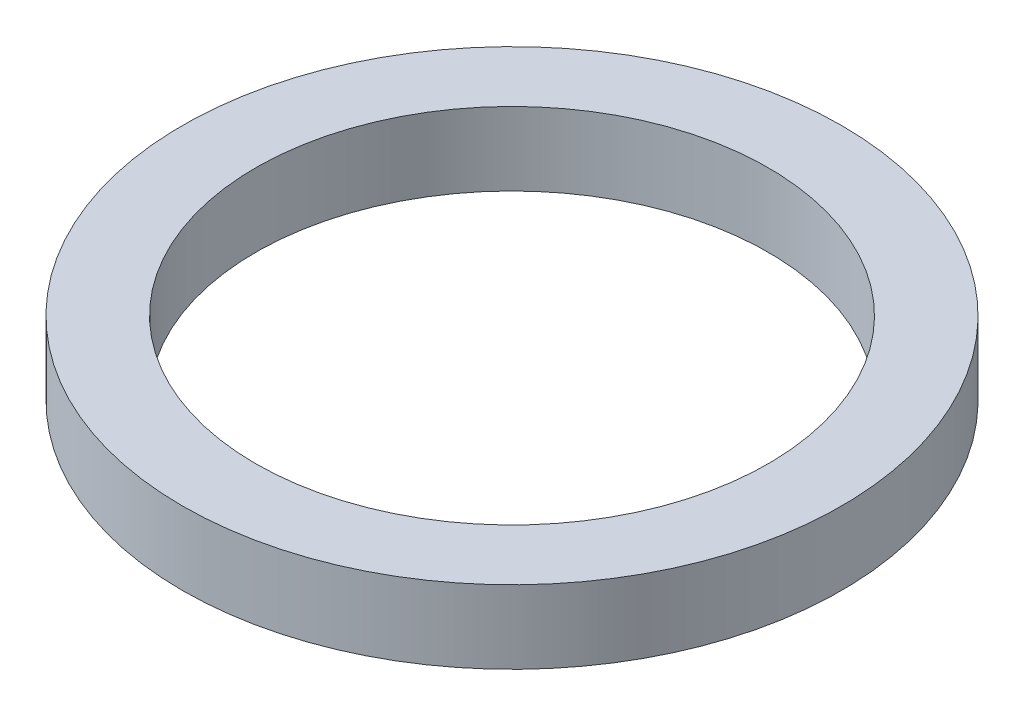
ISO-10303-21;
HEADER;
FILE_DESCRIPTION(('STEP AP214'),'2;1');
FILE_NAME('part.step','',(''),(''),'','','');
FILE_SCHEMA(('AUTOMOTIVE_DESIGN { 1 0 10303 214 1 1 1 1 }'));
ENDSEC;
DATA;
#1=APPLICATION_CONTEXT('core data for automotive mechanical design processes');
#2=APPLICATION_PROTOCOL_DEFINITION('international standard','automotive_design',2000,#1);
#3=PRODUCT_CONTEXT('',#1,'mechanical');
#4=PRODUCT('Part','Part','',(#3));
#5=PRODUCT_RELATED_PRODUCT_CATEGORY('part','',(#4));
#6=PRODUCT_DEFINITION_FORMATION('','',#4);
#7=PRODUCT_DEFINITION_CONTEXT('part definition',#1,'design');
#8=PRODUCT_DEFINITION('design','',#6,#7);
#9=PRODUCT_DEFINITION_SHAPE('','',#8);
#10=(LENGTH_UNIT() NAMED_UNIT(*) SI_UNIT(.MILLI.,.METRE.));
#11=(NAMED_UNIT(*) PLANE_ANGLE_UNIT() SI_UNIT($,.RADIAN.));
#12=(NAMED_UNIT(*) SI_UNIT($,.STERADIAN.) SOLID_ANGLE_UNIT());
#13=UNCERTAINTY_MEASURE_WITH_UNIT(LENGTH_MEASURE(1.E-05),#10,'distance_accuracy_value','');
#14=(GEOMETRIC_REPRESENTATION_CONTEXT(3) GLOBAL_UNCERTAINTY_ASSIGNED_CONTEXT((#13)) GLOBAL_UNIT_ASSIGNED_CONTEXT((#10,
#11,#12)) REPRESENTATION_CONTEXT('',''));
#15=CARTESIAN_POINT('',(0.,0.,0.));
#16=DIRECTION('',(0.,0.,1.));
#17=DIRECTION('',(1.,0.,0.));
#18=AXIS2_PLACEMENT_3D('',#15,#16,#17);
#19=CARTESIAN_POINT('',(0.,5.,0.));
#20=DIRECTION('',(0.,1.,0.));
#21=DIRECTION('',(0.,0.,1.));
#22=AXIS2_PLACEMENT_3D('',#19,#20,#21);
#23=PLANE('',#22);
#24=CARTESIAN_POINT('',(0.,5.,0.));
#25=DIRECTION('',(0.,1.,0.));
#26=DIRECTION('',(0.,0.,1.));
#27=AXIS2_PLACEMENT_3D('',#24,#25,#26);
#28=CIRCLE('',#27,22.5);
#29=CARTESIAN_POINT('',(0.,5.,22.5));
#30=VERTEX_POINT('',#29);
#31=EDGE_CURVE('E10',#30,#30,#28,.T.);
#32=ORIENTED_EDGE('',*,*,#31,.T.);
#33=EDGE_LOOP('',(#32));
#34=FACE_BOUND('',#33,.T.);
#35=CARTESIAN_POINT('',(0.,5.,0.));
#36=DIRECTION('',(0.,1.,0.));
#37=DIRECTION('',(0.,0.,1.));
#38=AXIS2_PLACEMENT_3D('',#35,#36,#37);
#39=CIRCLE('',#38,17.5);
#40=CARTESIAN_POINT('',(0.,5.,17.5));
#41=VERTEX_POINT('',#40);
#42=EDGE_CURVE('E54',#41,#41,#39,.T.);
#43=ORIENTED_EDGE('',*,*,#42,.F.);
#44=EDGE_LOOP('',(#43));
#45=FACE_BOUND('',#44,.T.);
#46=ADVANCED_FACE('F41',(#34,#45),#23,.T.);
#47=CARTESIAN_POINT('',(0.,0.,0.));
#48=DIRECTION('',(0.,1.,0.));
#49=DIRECTION('',(0.,0.,1.));
#50=AXIS2_PLACEMENT_3D('',#47,#48,#49);
#51=PLANE('',#50);
#52=CARTESIAN_POINT('',(0.,0.,0.));
#53=DIRECTION('',(0.,1.,0.));
#54=DIRECTION('',(0.,0.,1.));
#55=AXIS2_PLACEMENT_3D('',#52,#53,#54);
#56=CIRCLE('',#55,22.5);
#57=CARTESIAN_POINT('',(0.,0.,22.5));
#58=VERTEX_POINT('',#57);
#59=EDGE_CURVE('E45',#58,#58,#56,.T.);
#60=ORIENTED_EDGE('',*,*,#59,.F.);
#61=EDGE_LOOP('',(#60));
#62=FACE_BOUND('',#61,.T.);
#63=CARTESIAN_POINT('',(0.,0.,0.));
#64=DIRECTION('',(0.,1.,0.));
#65=DIRECTION('',(0.,0.,1.));
#66=AXIS2_PLACEMENT_3D('',#63,#64,#65);
#67=CIRCLE('',#66,17.5);
#68=CARTESIAN_POINT('',(0.,0.,17.5));
#69=VERTEX_POINT('',#68);
#70=EDGE_CURVE('E56',#69,#69,#67,.T.);
#71=ORIENTED_EDGE('',*,*,#70,.T.);
#72=EDGE_LOOP('',(#71));
#73=FACE_BOUND('',#72,.T.);
#74=ADVANCED_FACE('F68',(#62,#73),#51,.F.);
#75=CARTESIAN_POINT('',(0.,5.,0.));
#76=DIRECTION('',(0.,-1.,0.));
#77=DIRECTION('',(0.,0.,-1.));
#78=AXIS2_PLACEMENT_3D('',#75,#76,#77);
#79=CYLINDRICAL_SURFACE('',#78,22.5);
#80=ORIENTED_EDGE('',*,*,#31,.F.);
#81=EDGE_LOOP('',(#80));
#82=FACE_BOUND('',#81,.T.);
#83=ORIENTED_EDGE('',*,*,#59,.T.);
#84=EDGE_LOOP('',(#83));
#85=FACE_BOUND('',#84,.T.);
#86=ADVANCED_FACE('F43',(#82,#85),#79,.T.);
#87=CARTESIAN_POINT('',(0.,5.,0.));
#88=DIRECTION('',(0.,-1.,0.));
#89=DIRECTION('',(0.,0.,-1.));
#90=AXIS2_PLACEMENT_3D('',#87,#88,#89);
#91=CYLINDRICAL_SURFACE('',#90,17.5);
#92=ORIENTED_EDGE('',*,*,#42,.T.);
#93=EDGE_LOOP('',(#92));
#94=FACE_BOUND('',#93,.T.);
#95=ORIENTED_EDGE('',*,*,#70,.F.);
#96=EDGE_LOOP('',(#95));
#97=FACE_BOUND('',#96,.T.);
#98=ADVANCED_FACE('F64',(#94,#97),#91,.F.);
#99=CLOSED_SHELL('',(#46,#74,#86,#98));
#100=MANIFOLD_SOLID_BREP('B2',#99);
#101=ADVANCED_BREP_SHAPE_REPRESENTATION('',(#18,#100),#14);
#102=SHAPE_DEFINITION_REPRESENTATION(#9,#101);
ENDSEC;
END-ISO-10303-21;
